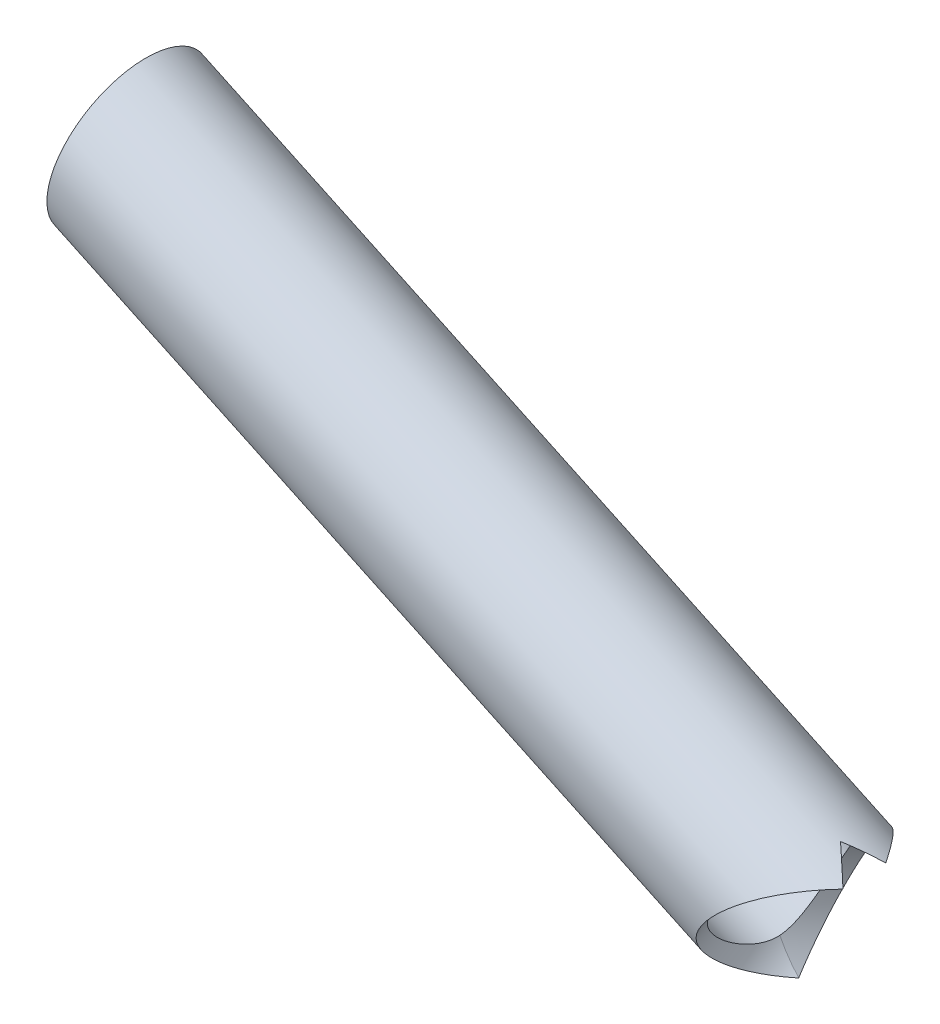
ISO-10303-21;
HEADER;
FILE_DESCRIPTION(('STEP AP214'),'2;1');
FILE_NAME('part.step','',(''),(''),'','','');
FILE_SCHEMA(('AUTOMOTIVE_DESIGN { 1 0 10303 214 1 1 1 1 }'));
ENDSEC;
DATA;
#1=APPLICATION_CONTEXT('core data for automotive mechanical design processes');
#2=APPLICATION_PROTOCOL_DEFINITION('international standard','automotive_design',2000,#1);
#3=PRODUCT_CONTEXT('',#1,'mechanical');
#4=PRODUCT('Part','Part','',(#3));
#5=PRODUCT_RELATED_PRODUCT_CATEGORY('part','',(#4));
#6=PRODUCT_DEFINITION_FORMATION('','',#4);
#7=PRODUCT_DEFINITION_CONTEXT('part definition',#1,'design');
#8=PRODUCT_DEFINITION('design','',#6,#7);
#9=PRODUCT_DEFINITION_SHAPE('','',#8);
#10=(LENGTH_UNIT() NAMED_UNIT(*) SI_UNIT(.MILLI.,.METRE.));
#11=(NAMED_UNIT(*) PLANE_ANGLE_UNIT() SI_UNIT($,.RADIAN.));
#12=(NAMED_UNIT(*) SI_UNIT($,.STERADIAN.) SOLID_ANGLE_UNIT());
#13=UNCERTAINTY_MEASURE_WITH_UNIT(LENGTH_MEASURE(1.E-05),#10,'distance_accuracy_value','');
#14=(GEOMETRIC_REPRESENTATION_CONTEXT(3) GLOBAL_UNCERTAINTY_ASSIGNED_CONTEXT((#13)) GLOBAL_UNIT_ASSIGNED_CONTEXT((#10,
#11,#12)) REPRESENTATION_CONTEXT('',''));
#15=CARTESIAN_POINT('',(0.,0.,0.));
#16=DIRECTION('',(0.,0.,1.));
#17=DIRECTION('',(1.,0.,0.));
#18=AXIS2_PLACEMENT_3D('',#15,#16,#17);
#19=CARTESIAN_POINT('',(64.9999999999999,540.,-1140.));
#20=DIRECTION('',(0.904818702200994,-0.425797036329879,0.));
#21=DIRECTION('',(0.425797036329879,0.904818702200994,0.));
#22=AXIS2_PLACEMENT_3D('',#19,#20,#21);
#23=CYLINDRICAL_SURFACE('',#22,7.90000000000002);
#24=CARTESIAN_POINT('',(65.,540.,-1140.));
#25=DIRECTION('',(-0.975914622854119,0.218152810890675,0.));
#26=DIRECTION('',(-0.218152810890675,-0.975914622854119,0.));
#27=AXIS2_PLACEMENT_3D('',#24,#25,#26);
#28=ELLIPSE('',#27,8.09497041544065,7.90000000000002);
#29=CARTESIAN_POINT('',(63.2340594497947,532.1,-1140.));
#30=VERTEX_POINT('',#29);
#31=EDGE_CURVE('E86',#30,#30,#28,.T.);
#32=ORIENTED_EDGE('',*,*,#31,.T.);
#33=EDGE_LOOP('',(#32));
#34=FACE_BOUND('',#33,.T.);
#35=CARTESIAN_POINT('',(143.048560840608,510.105860751672,-1144.91602308416));
#36=CARTESIAN_POINT('',(143.163370222972,510.152011430138,-1144.80198505592));
#37=CARTESIAN_POINT('',(143.278639824671,510.193486127539,-1144.68657564284));
#38=CARTESIAN_POINT('',(143.509536955995,510.267592572815,-1144.45340025688));
#39=CARTESIAN_POINT('',(143.625164304538,510.300228228046,-1144.33563535007));
#40=CARTESIAN_POINT('',(143.85610998535,510.357154512579,-1144.09824639122));
#41=CARTESIAN_POINT('',(143.971428500161,510.381459984025,-1143.9786260469));
#42=CARTESIAN_POINT('',(144.20152354449,510.422291475717,-1143.73754459076));
#43=CARTESIAN_POINT('',(144.31630000482,510.438816528088,-1143.61608325185));
#44=CARTESIAN_POINT('',(144.661518518923,510.477663396414,-1143.24670939374));
#45=CARTESIAN_POINT('',(144.890518214421,510.48870340098,-1142.99619307048));
#46=CARTESIAN_POINT('',(145.341320169768,510.484094092083,-1142.48895739719));
#47=CARTESIAN_POINT('',(145.563119360933,510.468433547775,-1142.23223548174));
#48=CARTESIAN_POINT('',(145.974181315168,510.415724138045,-1141.73832634655));
#49=CARTESIAN_POINT('',(146.164479548641,510.380971084398,-1141.50175336193));
#50=CARTESIAN_POINT('',(146.532954818433,510.293305499312,-1141.0224650782));
#51=CARTESIAN_POINT('',(146.71112875833,510.240388349647,-1140.77974823156));
#52=CARTESIAN_POINT('',(147.049903709312,510.11774038888,-1140.28797535941));
#53=CARTESIAN_POINT('',(147.2105799187,510.048086016564,-1140.03895263022));
#54=CARTESIAN_POINT('',(147.508381545535,509.892738082888,-1139.53223825964));
#55=CARTESIAN_POINT('',(147.645537246871,509.807065447701,-1139.27455828428));
#56=CARTESIAN_POINT('',(147.879799518012,509.625639793319,-1138.76392035876));
#57=CARTESIAN_POINT('',(147.978749436561,509.530744732635,-1138.51153670852));
#58=CARTESIAN_POINT('',(148.096714372128,509.379159224835,-1138.12762208943));
#59=CARTESIAN_POINT('',(148.1309423128,509.327140901259,-1137.99887826941));
#60=CARTESIAN_POINT('',(148.187929213195,509.220219197824,-1137.74008753255));
#61=CARTESIAN_POINT('',(148.210694031816,509.165317307658,-1137.61004131611));
#62=CARTESIAN_POINT('',(148.243790100472,509.052217630917,-1137.34789204732));
#63=CARTESIAN_POINT('',(148.253968674766,508.993988169784,-1137.2157830556));
#64=CARTESIAN_POINT('',(148.260627165081,508.875188626736,-1136.95226961295));
#65=CARTESIAN_POINT('',(148.25710810048,508.814618719329,-1136.82086511032));
#66=CARTESIAN_POINT('',(148.236263670299,508.691422884136,-1136.56001731923));
#67=CARTESIAN_POINT('',(148.218928348563,508.628795504928,-1136.43057551369));
#68=CARTESIAN_POINT('',(148.171038173654,508.501779076495,-1136.17504895208));
#69=CARTESIAN_POINT('',(148.140481550988,508.437389792545,-1136.04896464777));
#70=CARTESIAN_POINT('',(148.063640653414,508.300469277574,-1135.78885857271));
#71=CARTESIAN_POINT('',(148.016089888422,508.227767395986,-1135.65530262549));
#72=CARTESIAN_POINT('',(147.908344974929,508.080391040251,-1135.39456139282));
#73=CARTESIAN_POINT('',(147.848148815784,508.00571625406,-1135.26737712445));
#74=CARTESIAN_POINT('',(147.717020377759,507.854059958578,-1135.01967072633));
#75=CARTESIAN_POINT('',(147.646063434008,507.777073484425,-1134.89916479354));
#76=CARTESIAN_POINT('',(147.495418167192,507.620684795114,-1134.66537334506));
#77=CARTESIAN_POINT('',(147.415726869383,507.541281763619,-1134.55209031025));
#78=CARTESIAN_POINT('',(147.211837427383,507.343400284926,-1134.28349668384));
#79=CARTESIAN_POINT('',(147.083754873302,507.223424371967,-1134.13222711814));
#80=CARTESIAN_POINT('',(146.817003173004,506.976886729111,-1133.8451564853));
#81=CARTESIAN_POINT('',(146.678329694582,506.850322311008,-1133.70936180536));
#82=CARTESIAN_POINT('',(146.393635202653,506.589812761051,-1133.45325438942));
#83=CARTESIAN_POINT('',(146.247610444504,506.455863864271,-1133.3329496571));
#84=CARTESIAN_POINT('',(145.95097677114,506.180096832138,-1133.10811895554));
#85=CARTESIAN_POINT('',(145.800368456471,506.038279725703,-1133.00359092982));
#86=CARTESIAN_POINT('',(145.493134524895,505.742843460724,-1132.80832745943));
#87=CARTESIAN_POINT('',(145.336451593056,505.589021356716,-1132.71798850227));
#88=CARTESIAN_POINT('',(145.022838098838,505.272554216674,-1132.55482935216));
#89=CARTESIAN_POINT('',(144.865907526792,505.10990882746,-1132.48200986109));
#90=CARTESIAN_POINT('',(144.553970550845,504.776002698187,-1132.35465808105));
#91=CARTESIAN_POINT('',(144.398963120329,504.604746825157,-1132.30011559182));
#92=CARTESIAN_POINT('',(144.092822257857,504.253946399901,-1132.21006164742));
#93=CARTESIAN_POINT('',(143.941688658536,504.074402206709,-1132.17454936874));
#94=CARTESIAN_POINT('',(143.646789785791,503.709577131059,-1132.12359140878));
#95=CARTESIAN_POINT('',(143.502966127487,503.524371173697,-1132.10794943572));
#96=CARTESIAN_POINT('',(143.223038518227,503.147587952123,-1132.09673913526));
#97=CARTESIAN_POINT('',(143.086934670572,502.956010602709,-1132.10117107641));
#98=CARTESIAN_POINT('',(142.824448024133,502.568037444645,-1132.13054618182));
#99=CARTESIAN_POINT('',(142.698057479682,502.371645643546,-1132.15547281348));
#100=CARTESIAN_POINT('',(142.456646209805,501.975615101931,-1132.22596884738));
#101=CARTESIAN_POINT('',(142.34162360888,501.775976903361,-1132.27153483756));
#102=CARTESIAN_POINT('',(142.139482771031,501.403104458465,-1132.37536630969));
#103=CARTESIAN_POINT('',(142.050704846903,501.230033024768,-1132.43100741232));
#104=CARTESIAN_POINT('',(141.883509100372,500.884271903017,-1132.55707204256));
#105=CARTESIAN_POINT('',(141.805090660179,500.711582192804,-1132.627494688));
#106=CARTESIAN_POINT('',(141.659219473847,500.368007562026,-1132.78251815432));
#107=CARTESIAN_POINT('',(141.591764179073,500.197122230654,-1132.8671156706));
#108=CARTESIAN_POINT('',(141.468151300347,499.858469286093,-1133.04973159526));
#109=CARTESIAN_POINT('',(141.411993743226,499.69070168031,-1133.14775003551));
#110=CARTESIAN_POINT('',(141.313597906325,499.367785000286,-1133.35112125153));
#111=CARTESIAN_POINT('',(141.270807944402,499.212422514212,-1133.45587024123));
#112=CARTESIAN_POINT('',(141.195441415656,498.906645617519,-1133.67583987566));
#113=CARTESIAN_POINT('',(141.162868146973,498.75623281875,-1133.79106388647));
#114=CARTESIAN_POINT('',(141.107711173287,498.461388582837,-1134.03100961014));
#115=CARTESIAN_POINT('',(141.085123265647,498.31695465255,-1134.15572730134));
#116=CARTESIAN_POINT('',(141.049506006446,498.034751551424,-1134.41387077433));
#117=CARTESIAN_POINT('',(141.036480837899,497.896985321809,-1134.54730033918));
#118=CARTESIAN_POINT('',(141.018832229004,497.618729994833,-1134.83239219351));
#119=CARTESIAN_POINT('',(141.014920653962,497.47882636802,-1134.98466985132));
#120=CARTESIAN_POINT('',(141.016771367516,497.208475242965,-1135.29724405442));
#121=CARTESIAN_POINT('',(141.022530878846,497.078025041183,-1135.45753828474));
#122=CARTESIAN_POINT('',(141.04280869783,496.827078030381,-1135.78556407937));
#123=CARTESIAN_POINT('',(141.057339618955,496.706595839808,-1135.95330603123));
#124=CARTESIAN_POINT('',(141.094112564588,496.476538164319,-1136.29522324444));
#125=CARTESIAN_POINT('',(141.116352788033,496.366960139638,-1136.4693969947));
#126=CARTESIAN_POINT('',(141.170938852264,496.144866790332,-1136.84845099911));
#127=CARTESIAN_POINT('',(141.20426420438,496.034092510476,-1137.05421340157));
#128=CARTESIAN_POINT('',(141.277379708537,495.828897177432,-1137.47269401909));
#129=CARTESIAN_POINT('',(141.317171641559,495.734480644223,-1137.68541413746));
#130=CARTESIAN_POINT('',(141.400756937109,495.5636834918,-1138.11709774585));
#131=CARTESIAN_POINT('',(141.444547680934,495.487291184879,-1138.33605708624));
#132=CARTESIAN_POINT('',(141.533104589502,495.354589011231,-1138.77963927399));
#133=CARTESIAN_POINT('',(141.577870202119,495.298268075424,-1139.00425892634));
#134=CARTESIAN_POINT('',(141.676167646918,495.196442144941,-1139.51894448991));
#135=CARTESIAN_POINT('',(141.728890211877,495.157727621465,-1139.81062037518));
#136=CARTESIAN_POINT('',(141.797298814569,495.131972075505,-1140.25131384123));
#137=CARTESIAN_POINT('',(141.818311878534,495.128764216792,-1140.39864103447));
#138=CARTESIAN_POINT('',(141.855434958029,495.133897300619,-1140.6936829183));
#139=CARTESIAN_POINT('',(141.871547712249,495.142231777849,-1140.84139734574));
#140=CARTESIAN_POINT('',(141.897761502859,495.171276487838,-1141.13818283399));
#141=CARTESIAN_POINT('',(141.907779171487,495.192150903654,-1141.28724558337));
#142=CARTESIAN_POINT('',(141.92036161596,495.246691032988,-1141.58333845306));
#143=CARTESIAN_POINT('',(141.922927205832,495.28035534895,-1141.73036879364));
#144=CARTESIAN_POINT('',(141.919985536864,495.360207480499,-1142.02086079144));
#145=CARTESIAN_POINT('',(141.914480708093,495.40639152288,-1142.16432350966));
#146=CARTESIAN_POINT('',(141.895386997371,495.510478833187,-1142.44637186909));
#147=CARTESIAN_POINT('',(141.881797202351,495.568383424275,-1142.58495695756));
#148=CARTESIAN_POINT('',(141.846029757211,495.69853562814,-1142.86448395705));
#149=CARTESIAN_POINT('',(141.823380550172,495.771440877611,-1143.00505759081));
#150=CARTESIAN_POINT('',(141.770731148851,495.927473738978,-1143.27903872331));
#151=CARTESIAN_POINT('',(141.740725782245,496.010608522973,-1143.41244109891));
#152=CARTESIAN_POINT('',(141.67464523264,496.18572511773,-1143.67222376536));
#153=CARTESIAN_POINT('',(141.638553751255,496.277730392233,-1143.79858395543));
#154=CARTESIAN_POINT('',(141.561731227681,496.469021865902,-1144.04408262755));
#155=CARTESIAN_POINT('',(141.521000993557,496.568306795891,-1144.16322236187));
#156=CARTESIAN_POINT('',(141.405686209475,496.846611097555,-1144.47783998215));
#157=CARTESIAN_POINT('',(141.327785383912,497.031712079475,-1144.66673346333));
#158=CARTESIAN_POINT('',(141.167150155061,497.416489038009,-1145.02682466639));
#159=CARTESIAN_POINT('',(141.084412059725,497.616176177281,-1145.19800858802));
#160=CARTESIAN_POINT('',(140.917825739332,498.028326369639,-1145.52484272824));
#161=CARTESIAN_POINT('',(140.833975189188,498.240821256695,-1145.6804514489));
#162=CARTESIAN_POINT('',(140.668493812235,498.676640639756,-1145.97676491018));
#163=CARTESIAN_POINT('',(140.58686231875,498.899961825794,-1146.1174741647));
#164=CARTESIAN_POINT('',(140.420937401172,499.378024100296,-1146.39714470069));
#165=CARTESIAN_POINT('',(140.337111496135,499.633748342398,-1146.53470627331));
#166=CARTESIAN_POINT('',(140.178187705031,500.156435424972,-1146.79276403148));
#167=CARTESIAN_POINT('',(140.103093002554,500.423402316731,-1146.91325399582));
#168=CARTESIAN_POINT('',(139.964977234201,500.96647778032,-1147.13581188885));
#169=CARTESIAN_POINT('',(139.901903261891,501.242539711516,-1147.23796042241));
#170=CARTESIAN_POINT('',(139.790569599018,501.80382613952,-1147.42294990881));
#171=CARTESIAN_POINT('',(139.74229550675,502.089041428681,-1147.50580961251));
#172=CARTESIAN_POINT('',(139.691988819648,502.460167139264,-1147.59843292821));
#173=CARTESIAN_POINT('',(139.681593749546,502.542576827691,-1147.61805793526));
#174=CARTESIAN_POINT('',(139.662351396959,502.707998435465,-1147.6555230669));
#175=CARTESIAN_POINT('',(139.653504437805,502.791010476857,-1147.67336281829));
#176=CARTESIAN_POINT('',(139.645473579606,502.874300322043,-1147.69027900346));
#177=B_SPLINE_CURVE_WITH_KNOTS('',3,(#35,#36,#37,#38,#39,#40,#41,#42,#43,#44,#45,#46,#47,#48,
#49,#50,#51,#52,#53,#54,#55,#56,#57,#58,#59,#60,#61,#62,#63,#64,#65,#66,#67,#68,#69,#70,#71,#72,
#73,#74,#75,#76,#77,#78,#79,#80,#81,#82,#83,#84,#85,#86,#87,#88,#89,#90,#91,#92,#93,#94,#95,#96,
#97,#98,#99,#100,#101,#102,#103,#104,#105,#106,#107,#108,#109,#110,#111,#112,#113,#114,#115,
#116,#117,#118,#119,#120,#121,#122,#123,#124,#125,#126,#127,#128,#129,#130,#131,#132,#133,#134,
#135,#136,#137,#138,#139,#140,#141,#142,#143,#144,#145,#146,#147,#148,#149,#150,#151,#152,#153,
#154,#155,#156,#157,#158,#159,#160,#161,#162,#163,#164,#165,#166,#167,#168,#169,#170,#171,#172,
#173,#174,#175,#176),.UNSPECIFIED.,.F.,.F.,(4,2,2,2,2,2,2,2,2,2,2,2,2,2,2,2,2,2,2,2,2,2,2,2,2,2,
2,2,2,2,2,2,2,2,2,2,2,2,2,2,2,2,2,2,2,2,2,2,2,2,2,2,2,2,2,2,2,2,2,2,2,2,2,2,2,2,2,2,2,2,4),(0.,
0.504689940522062,1.00915641407158,1.51271933369553,2.01634487946529,3.03370178150456,
4.05148671205766,4.96747761663806,5.88370158483334,6.79581813954214,7.70675133202878,
8.56553089212274,8.99415431201406,9.42255843592522,9.85610983800353,10.2896289758289,
10.7234607953607,11.1573506953676,11.634597606585,12.1119204586056,12.5903544005201,
13.0689517966832,13.7630266836227,14.4573870174604,15.1521047003563,15.8467317488392,
16.5582236962823,17.2697441443278,17.9808668343276,18.6919587487715,19.3959699746095,
20.0999906188607,20.8034439025711,21.5067809351125,22.1129436593013,22.719070218433,
23.3250556673266,23.9310425553299,24.5070129382203,25.0831690643089,25.6590824664374,
26.2352476395979,26.8550959264349,27.4747662405066,28.0953297833208,28.7157484464046,
29.4231271231464,30.1307009523735,30.8378146906218,31.5445378599347,32.4380052589641,
32.8841367726985,33.3300184919237,33.7818693197735,34.2336707879696,34.6853362429514,
35.1370527160472,35.6162108807113,36.0957069261236,36.5765080513598,37.0572255494062,
37.8829754141146,38.7093639759195,39.5378987880835,40.3661818671199,41.2720909807637,
42.1783293797661,43.0804820933881,43.9817541187345,44.2377770566094,44.4938534022914),.UNSPECIFIED.);
#178=CARTESIAN_POINT('',(147.127608681563,510.080894448992,-1140.16261756922));
#179=VERTEX_POINT('',#178);
#180=CARTESIAN_POINT('',(141.903149365728,495.185987199564,-1141.23149369237));
#181=VERTEX_POINT('',#180);
#182=EDGE_CURVE('E58',#179,#181,#177,.T.);
#183=ORIENTED_EDGE('',*,*,#182,.T.);
#184=CARTESIAN_POINT('',(138.988939419425,498.500224013531,-1134.91454017282));
#185=CARTESIAN_POINT('',(139.064342123002,498.384010125727,-1135.00139332453));
#186=CARTESIAN_POINT('',(139.140373533804,498.269445978519,-1135.08991904311));
#187=CARTESIAN_POINT('',(139.29332277477,498.043741615248,-1135.27055178895));
#188=CARTESIAN_POINT('',(139.370240767991,497.93260204329,-1135.36265948264));
#189=CARTESIAN_POINT('',(139.52500171475,497.713294138404,-1135.55119364836));
#190=CARTESIAN_POINT('',(139.602847440331,497.605146253477,-1135.64764166841));
#191=CARTESIAN_POINT('',(139.758581356572,497.392715750246,-1135.84466455989));
#192=CARTESIAN_POINT('',(139.83646954482,497.288432931789,-1135.94523921706));
#193=CARTESIAN_POINT('',(139.994481782258,497.080486341537,-1136.15445993404));
#194=CARTESIAN_POINT('',(140.074589596014,496.97696970434,-1136.26326498279));
#195=CARTESIAN_POINT('',(140.233645898159,496.774876791374,-1136.48617682266));
#196=CARTESIAN_POINT('',(140.312594490605,496.67630007023,-1136.60028313404));
#197=CARTESIAN_POINT('',(140.468380934632,496.484927211552,-1136.83411844195));
#198=CARTESIAN_POINT('',(140.545223011691,496.392118943067,-1136.95383464132));
#199=CARTESIAN_POINT('',(140.696009047951,496.212934336398,-1137.19969377139));
#200=CARTESIAN_POINT('',(140.769953984702,496.126555819683,-1137.3258345007));
#201=CARTESIAN_POINT('',(140.906126754952,495.970193845911,-1137.57125873891));
#202=CARTESIAN_POINT('',(140.968760714583,495.899445581123,-1137.68982685551));
#203=CARTESIAN_POINT('',(141.089927031393,495.764959188427,-1137.93293261607));
#204=CARTESIAN_POINT('',(141.14845920795,495.701221369157,-1138.05747052249));
#205=CARTESIAN_POINT('',(141.259985455238,495.5824253176,-1138.31166054289));
#206=CARTESIAN_POINT('',(141.313019344577,495.527302959067,-1138.44126491039));
#207=CARTESIAN_POINT('',(141.413107535065,495.42643393081,-1138.70632985409));
#208=CARTESIAN_POINT('',(141.460162129961,495.380686800434,-1138.84179014217));
#209=CARTESIAN_POINT('',(141.548136267465,495.299243984901,-1139.12004378358));
#210=CARTESIAN_POINT('',(141.588955027174,495.263706592589,-1139.2629158523));
#211=CARTESIAN_POINT('',(141.663118100782,495.20471157455,-1139.55303247975));
#212=CARTESIAN_POINT('',(141.696462922533,495.181253127922,-1139.70027674062));
#213=CARTESIAN_POINT('',(141.755740469433,495.147069443564,-1139.9979240687));
#214=CARTESIAN_POINT('',(141.781662601687,495.136362335113,-1140.14833132468));
#215=CARTESIAN_POINT('',(141.826593782954,495.127885392632,-1140.450533379));
#216=CARTESIAN_POINT('',(141.845601930625,495.130117244744,-1140.60232835562));
#217=CARTESIAN_POINT('',(141.878798811222,495.147762528219,-1140.91623762831));
#218=CARTESIAN_POINT('',(141.89256694516,495.164070641118,-1141.07834473035));
#219=CARTESIAN_POINT('',(141.914863541562,495.210226310162,-1141.4009570325));
#220=CARTESIAN_POINT('',(141.923391410985,495.240075398078,-1141.56146204929));
#221=CARTESIAN_POINT('',(141.936823257572,495.312340043052,-1141.88010108485));
#222=CARTESIAN_POINT('',(141.941719467042,495.354782265637,-1142.03822931676));
#223=CARTESIAN_POINT('',(141.949376421257,495.451144861955,-1142.35101909108));
#224=CARTESIAN_POINT('',(141.952136496118,495.505068829562,-1142.50567953124));
#225=CARTESIAN_POINT('',(141.95771032808,495.644108024101,-1142.86438438721));
#226=CARTESIAN_POINT('',(141.960204809408,495.733534661446,-1143.06676868899));
#227=CARTESIAN_POINT('',(141.966574185629,495.929355724185,-1143.46314477352));
#228=CARTESIAN_POINT('',(141.970449497392,496.035755268312,-1143.65713400196));
#229=CARTESIAN_POINT('',(141.981800266666,496.263740982568,-1144.03586391417));
#230=CARTESIAN_POINT('',(141.989275888172,496.385327844302,-1144.22060417622));
#231=CARTESIAN_POINT('',(142.009594889129,496.642165924132,-1144.58001064351));
#232=CARTESIAN_POINT('',(142.022438305396,496.777417235942,-1144.75467677963));
#233=CARTESIAN_POINT('',(142.055124031722,497.062207298794,-1145.09544389593));
#234=CARTESIAN_POINT('',(142.075061644616,497.211919304697,-1145.26139106236));
#235=CARTESIAN_POINT('',(142.123051642152,497.52266519575,-1145.58107904501));
#236=CARTESIAN_POINT('',(142.151104201788,497.683699324995,-1145.73481959792));
#237=CARTESIAN_POINT('',(142.216191053138,498.01569575448,-1146.02900470777));
#238=CARTESIAN_POINT('',(142.253222146984,498.186654503435,-1146.16945397394));
#239=CARTESIAN_POINT('',(142.336896319726,498.537169550375,-1146.43604550111));
#240=CARTESIAN_POINT('',(142.383539257896,498.716725722457,-1146.56218797153));
#241=CARTESIAN_POINT('',(142.487094751025,499.083963369828,-1146.79973903596));
#242=CARTESIAN_POINT('',(142.544061156791,499.2716833306,-1146.91106479244));
#243=CARTESIAN_POINT('',(142.668226534989,499.652764160129,-1147.11715037247));
#244=CARTESIAN_POINT('',(142.735425644906,499.846125104649,-1147.21190997341));
#245=CARTESIAN_POINT('',(142.879910876038,500.236768478198,-1147.38391767356));
#246=CARTESIAN_POINT('',(142.957194424287,500.4340498961,-1147.46117022583));
#247=CARTESIAN_POINT('',(143.121477553845,500.830850079581,-1147.59742956571));
#248=CARTESIAN_POINT('',(143.208476487615,501.030368695251,-1147.65643756834));
#249=CARTESIAN_POINT('',(143.384999792288,501.415591551999,-1147.75210175871));
#250=CARTESIAN_POINT('',(143.473897443765,501.601262163641,-1147.79005572894));
#251=CARTESIAN_POINT('',(143.658841275338,501.971667356939,-1147.84949467073));
#252=CARTESIAN_POINT('',(143.754887075223,502.156401987823,-1147.87098051756));
#253=CARTESIAN_POINT('',(143.953286859624,502.523614148198,-1147.89738926131));
#254=CARTESIAN_POINT('',(144.055639955571,502.706091991296,-1147.90231448587));
#255=CARTESIAN_POINT('',(144.265712945523,503.067623434383,-1147.89568481026));
#256=CARTESIAN_POINT('',(144.373432905046,503.246676992533,-1147.88412970884));
#257=CARTESIAN_POINT('',(144.591994367715,503.598387998981,-1147.84497761093));
#258=CARTESIAN_POINT('',(144.702789861315,503.771093515721,-1147.81755441381));
#259=CARTESIAN_POINT('',(144.927480119348,504.111221401088,-1147.74714050068));
#260=CARTESIAN_POINT('',(145.041374846474,504.278643833256,-1147.70414997197));
#261=CARTESIAN_POINT('',(145.271110549831,504.60752602288,-1147.60301146468));
#262=CARTESIAN_POINT('',(145.386952028759,504.768984204703,-1147.54485951299));
#263=CARTESIAN_POINT('',(145.61929877739,505.085340384969,-1147.41387706657));
#264=CARTESIAN_POINT('',(145.735804092312,505.240237930311,-1147.34104556002));
#265=CARTESIAN_POINT('',(145.975276607192,505.552386714855,-1147.17628260396));
#266=CARTESIAN_POINT('',(146.098200561215,505.709196845755,-1147.08345197538));
#267=CARTESIAN_POINT('',(146.341530666902,506.014707281825,-1146.88238614488));
#268=CARTESIAN_POINT('',(146.461936557822,506.163406749675,-1146.77414935662));
#269=CARTESIAN_POINT('',(146.69830353538,506.452674601213,-1146.54277239479));
#270=CARTESIAN_POINT('',(146.81426249124,506.593239103004,-1146.41962519143));
#271=CARTESIAN_POINT('',(147.039375752793,506.86625995176,-1146.15898636739));
#272=CARTESIAN_POINT('',(147.148531289344,506.998717765287,-1146.0214973535));
#273=CARTESIAN_POINT('',(147.33840678853,507.232568929918,-1145.75880828916));
#274=CARTESIAN_POINT('',(147.420698790023,507.335247395501,-1145.63588400048));
#275=CARTESIAN_POINT('',(147.577059958968,507.535609981026,-1145.38106965424));
#276=CARTESIAN_POINT('',(147.651130686762,507.633295046778,-1145.24918130569));
#277=CARTESIAN_POINT('',(147.788827883727,507.823830743047,-1144.9770681347));
#278=CARTESIAN_POINT('',(147.852470355034,507.916688628476,-1144.83685654337));
#279=CARTESIAN_POINT('',(147.966992345915,508.09803080676,-1144.54860126426));
#280=CARTESIAN_POINT('',(148.017875847978,508.18651645739,-1144.40056003787));
#281=CARTESIAN_POINT('',(148.09423576606,508.339359443011,-1144.13284550988));
#282=CARTESIAN_POINT('',(148.12286742726,508.404556054667,-1144.01454911036));
#283=CARTESIAN_POINT('',(148.169877694966,508.532623008837,-1143.7747182777));
#284=CARTESIAN_POINT('',(148.188259221723,508.595494009145,-1143.65318477715));
#285=CARTESIAN_POINT('',(148.213763413846,508.718863963792,-1143.40799361275));
#286=CARTESIAN_POINT('',(148.220904731477,508.779366685032,-1143.28433981288));
#287=CARTESIAN_POINT('',(148.223332930288,508.898099608884,-1143.03582092158));
#288=CARTESIAN_POINT('',(148.218619893095,508.956329827143,-1142.91095583848));
#289=CARTESIAN_POINT('',(148.19713877027,509.07054083059,-1142.6610291446));
#290=CARTESIAN_POINT('',(148.180354304801,509.126518450111,-1142.53596749741));
#291=CARTESIAN_POINT('',(148.135043286336,509.236065764948,-1142.28693480964));
#292=CARTESIAN_POINT('',(148.106516586963,509.289635430239,-1142.16296378267));
#293=CARTESIAN_POINT('',(148.038453600828,509.394367802714,-1141.91685886269));
#294=CARTESIAN_POINT('',(147.998902802683,509.445527232746,-1141.79472761635));
#295=CARTESIAN_POINT('',(147.909874896852,509.545330119464,-1141.55306553692));
#296=CARTESIAN_POINT('',(147.860394324814,509.593972690584,-1141.43353562758));
#297=CARTESIAN_POINT('',(147.724325452203,509.713682513772,-1141.13523144858));
#298=CARTESIAN_POINT('',(147.631922134159,509.783060870438,-1140.95842595949));
#299=CARTESIAN_POINT('',(147.430903286163,509.91591248582,-1140.61195582529));
#300=CARTESIAN_POINT('',(147.32227684165,509.979381721979,-1140.44229608697));
#301=CARTESIAN_POINT('',(147.09176006821,510.10074227221,-1140.10882619479));
#302=CARTESIAN_POINT('',(146.96980497713,510.158603517889,-1139.94505025033));
#303=CARTESIAN_POINT('',(146.71588132835,510.268388429798,-1139.62350630152));
#304=CARTESIAN_POINT('',(146.583915088689,510.320313463593,-1139.465736919));
#305=CARTESIAN_POINT('',(146.318595273616,510.415840482627,-1139.1628351625));
#306=CARTESIAN_POINT('',(146.185617140097,510.45972346914,-1139.01746058498));
#307=CARTESIAN_POINT('',(145.913787203637,510.542007860478,-1138.73070046939));
#308=CARTESIAN_POINT('',(145.774934913781,510.580408809733,-1138.58931526362));
#309=CARTESIAN_POINT('',(145.494481301359,510.651058123967,-1138.3120341123));
#310=CARTESIAN_POINT('',(145.352949791733,510.683388189762,-1138.17608814537));
#311=CARTESIAN_POINT('',(145.066017051719,510.742355322506,-1137.90718961321));
#312=CARTESIAN_POINT('',(144.920617372416,510.768994633805,-1137.77423588646));
#313=CARTESIAN_POINT('',(144.773629099719,510.792689584157,-1137.64254723796));
#314=B_SPLINE_CURVE_WITH_KNOTS('',3,(#184,#185,#186,#187,#188,#189,#190,#191,#192,#193,#194,
#195,#196,#197,#198,#199,#200,#201,#202,#203,#204,#205,#206,#207,#208,#209,#210,#211,#212,#213,
#214,#215,#216,#217,#218,#219,#220,#221,#222,#223,#224,#225,#226,#227,#228,#229,#230,#231,#232,
#233,#234,#235,#236,#237,#238,#239,#240,#241,#242,#243,#244,#245,#246,#247,#248,#249,#250,#251,
#252,#253,#254,#255,#256,#257,#258,#259,#260,#261,#262,#263,#264,#265,#266,#267,#268,#269,#270,
#271,#272,#273,#274,#275,#276,#277,#278,#279,#280,#281,#282,#283,#284,#285,#286,#287,#288,#289,
#290,#291,#292,#293,#294,#295,#296,#297,#298,#299,#300,#301,#302,#303,#304,#305,#306,#307,#308,
#309,#310,#311,#312,#313),.UNSPECIFIED.,.F.,.F.,(4,2,2,2,2,2,2,2,2,2,2,2,2,2,2,2,2,2,2,2,2,2,2,
2,2,2,2,2,2,2,2,2,2,2,2,2,2,2,2,2,2,2,2,2,2,2,2,2,2,2,2,2,2,2,2,2,2,2,2,2,2,2,2,2,4),(0.,
0.49051308527199,0.981117871440357,1.47450763947265,1.96787182149271,2.47836125236723,
2.9888045753576,3.49813534629652,4.00729275266161,4.46184586132367,4.91641897385641,
5.3674284718684,5.81841580423304,6.27605841042795,6.73366991056406,7.19193124841335,
7.6502523060492,8.14004722976607,8.62989757347911,9.12079265195676,9.61184161081752,
10.2747460416458,10.9378507721442,11.6009857102478,12.2641251965003,12.9365322188418,
13.608953742241,14.2811361214931,14.9533086601381,15.6290940683906,16.3048885572135,
16.9805109581646,17.6560883550995,18.283299240676,18.9104767885826,19.5375661812379,
20.1646632312024,20.7850184615976,21.4053662281156,22.025876722624,22.6464300021676,
23.3051472798997,23.9639324333951,24.623029401343,25.2820067788505,25.8217833583827,
26.3614573160663,26.9002952286147,27.438964742338,27.8527954387309,28.2665081749051,
28.6795336599596,29.0925563009628,29.5061404362295,29.919729727323,30.3338660316791,
30.748147074013,31.3807147169825,32.0137098707527,32.6499302649462,33.2860037920461,
33.8913292895661,34.4967050616745,35.0932352921686,35.6895298238737),.UNSPECIFIED.);
#315=EDGE_CURVE('E92',#181,#179,#314,.T.);
#316=ORIENTED_EDGE('',*,*,#315,.T.);
#317=EDGE_LOOP('',(#183,#316));
#318=FACE_BOUND('',#317,.T.);
#319=ADVANCED_FACE('F39',(#34,#318),#23,.F.);
#320=CARTESIAN_POINT('',(64.9999999999999,540.,-1140.));
#321=DIRECTION('',(0.904818702200994,-0.425797036329879,0.));
#322=DIRECTION('',(0.425797036329879,0.904818702200994,0.));
#323=AXIS2_PLACEMENT_3D('',#320,#321,#322);
#324=CYLINDRICAL_SURFACE('',#323,9.49999999999999);
#325=CARTESIAN_POINT('',(65.,540.,-1140.));
#326=DIRECTION('',(-0.975914622854119,0.218152810890675,0.));
#327=DIRECTION('',(-0.218152810890675,-0.975914622854119,0.));
#328=AXIS2_PLACEMENT_3D('',#325,#326,#327);
#329=ELLIPSE('',#328,9.73445809451721,9.49999999999999);
#330=CARTESIAN_POINT('',(62.8764006041836,530.5,-1140.));
#331=VERTEX_POINT('',#330);
#332=EDGE_CURVE('E89',#331,#331,#329,.T.);
#333=ORIENTED_EDGE('',*,*,#332,.F.);
#334=EDGE_LOOP('',(#333));
#335=FACE_BOUND('',#334,.T.);
#336=CARTESIAN_POINT('',(150.,500.,-1140.));
#337=DIRECTION('',(0.730698843528213,-0.456511552407961,-0.507618363127858));
#338=DIRECTION('',(0.540188066054772,-0.0680580566202291,0.838787788550288));
#339=AXIS2_PLACEMENT_3D('',#336,#337,#338);
#340=ELLIPSE('',#339,11.1042116245899,9.49999999999999);
#341=CARTESIAN_POINT('',(144.44612585051,492.166890178091,-1140.95013168984));
#342=VERTEX_POINT('',#341);
#343=CARTESIAN_POINT('',(153.965906430516,508.427551164847,-1141.87028541894));
#344=VERTEX_POINT('',#343);
#345=EDGE_CURVE('E73',#342,#344,#340,.T.);
#346=ORIENTED_EDGE('',*,*,#345,.F.);
#347=CARTESIAN_POINT('',(150.,500.,-1140.));
#348=DIRECTION('',(0.632795525843136,-0.518432072130128,0.575150422984954));
#349=DIRECTION('',(0.661636513716334,-0.0238473310187051,-0.749445413969943));
#350=AXIS2_PLACEMENT_3D('',#347,#348,#349);
#351=ELLIPSE('',#350,11.9751109349285,9.49999999999999);
#352=CARTESIAN_POINT('',(153.821397243635,508.120469142726,-1136.88473050791));
#353=VERTEX_POINT('',#352);
#354=EDGE_CURVE('E11',#353,#342,#351,.T.);
#355=ORIENTED_EDGE('',*,*,#354,.F.);
#356=CARTESIAN_POINT('',(150.,500.,-1140.));
#357=DIRECTION('',(0.661636513716334,-0.0238473310187051,-0.749445413969943));
#358=DIRECTION('',(0.632795525843136,-0.518432072130128,0.575150422984954));
#359=AXIS2_PLACEMENT_3D('',#356,#357,#358);
#360=ELLIPSE('',#359,15.6040778434728,9.49999999999999);
#361=CARTESIAN_POINT('',(150.750146002882,510.139619946227,-1139.6603873903));
#362=VERTEX_POINT('',#361);
#363=EDGE_CURVE('E50',#362,#353,#360,.T.);
#364=ORIENTED_EDGE('',*,*,#363,.F.);
#365=CARTESIAN_POINT('',(150.,500.,-1140.));
#366=DIRECTION('',(0.540188066054772,-0.0680580566202291,0.838787788550288));
#367=DIRECTION('',(0.730698843528213,-0.456511552407961,-0.507618363127858));
#368=AXIS2_PLACEMENT_3D('',#365,#366,#367);
#369=ELLIPSE('',#368,18.3485819047058,9.49999999999999);
#370=EDGE_CURVE('E75',#344,#362,#369,.T.);
#371=ORIENTED_EDGE('',*,*,#370,.F.);
#372=EDGE_LOOP('',(#346,#355,#364,#371));
#373=FACE_BOUND('',#372,.T.);
#374=ADVANCED_FACE('F81',(#335,#373),#324,.T.);
#375=CARTESIAN_POINT('',(65.,540.,-1140.));
#376=DIRECTION('',(-0.975914622854119,0.218152810890675,0.));
#377=DIRECTION('',(-0.218152810890675,-0.975914622854119,0.));
#378=AXIS2_PLACEMENT_3D('',#375,#376,#377);
#379=PLANE('',#378);
#380=ORIENTED_EDGE('',*,*,#31,.F.);
#381=EDGE_LOOP('',(#380));
#382=FACE_BOUND('',#381,.T.);
#383=ORIENTED_EDGE('',*,*,#332,.T.);
#384=EDGE_LOOP('',(#383));
#385=FACE_BOUND('',#384,.T.);
#386=ADVANCED_FACE('F108',(#382,#385),#379,.T.);
#387=CARTESIAN_POINT('',(325.,320.,-1580.));
#388=DIRECTION('',(-0.345452680982297,0.355322757581791,0.86856674075549));
#389=DIRECTION('',(0.,-0.925546956205677,0.378632845720504));
#390=AXIS2_PLACEMENT_3D('',#387,#388,#389);
#391=CYLINDRICAL_SURFACE('',#390,9.49999999999999);
#392=CARTESIAN_POINT('',(150.,500.,-1140.));
#393=DIRECTION('',(-0.136924020573454,-0.023039322625737,0.990313587810925));
#394=DIRECTION('',(-0.508281006832033,0.859722512143853,-0.050275443378224));
#395=AXIS2_PLACEMENT_3D('',#392,#393,#394);
#396=ELLIPSE('',#395,10.5641498478138,9.49999999999999);
#397=EDGE_CURVE('E44',#181,#342,#396,.T.);
#398=ORIENTED_EDGE('',*,*,#397,.T.);
#399=ORIENTED_EDGE('',*,*,#345,.T.);
#400=ORIENTED_EDGE('',*,*,#370,.T.);
#401=EDGE_CURVE('E82',#362,#179,#396,.T.);
#402=ORIENTED_EDGE('',*,*,#401,.T.);
#403=ORIENTED_EDGE('',*,*,#315,.F.);
#404=EDGE_LOOP('',(#398,#399,#400,#402,#403));
#405=FACE_BOUND('',#404,.T.);
#406=ADVANCED_FACE('F41',(#405),#391,.F.);
#407=CARTESIAN_POINT('',(150.,500.,-1140.));
#408=DIRECTION('',(0.0991899501072693,-0.396759800429077,0.912547540986877));
#409=DIRECTION('',(0.,-0.917070056253235,-0.39872611141445));
#410=AXIS2_PLACEMENT_3D('',#407,#408,#409);
#411=CYLINDRICAL_SURFACE('',#410,9.49999999999999);
#412=ORIENTED_EDGE('',*,*,#401,.F.);
#413=ORIENTED_EDGE('',*,*,#363,.T.);
#414=ORIENTED_EDGE('',*,*,#354,.T.);
#415=ORIENTED_EDGE('',*,*,#397,.F.);
#416=ORIENTED_EDGE('',*,*,#182,.F.);
#417=EDGE_LOOP('',(#412,#413,#414,#415,#416));
#418=FACE_BOUND('',#417,.T.);
#419=ADVANCED_FACE('F112',(#418),#411,.F.);
#420=CLOSED_SHELL('',(#319,#374,#386,#406,#419));
#421=MANIFOLD_SOLID_BREP('B2',#420);
#422=ADVANCED_BREP_SHAPE_REPRESENTATION('',(#18,#421),#14);
#423=SHAPE_DEFINITION_REPRESENTATION(#9,#422);
ENDSEC;
END-ISO-10303-21;
